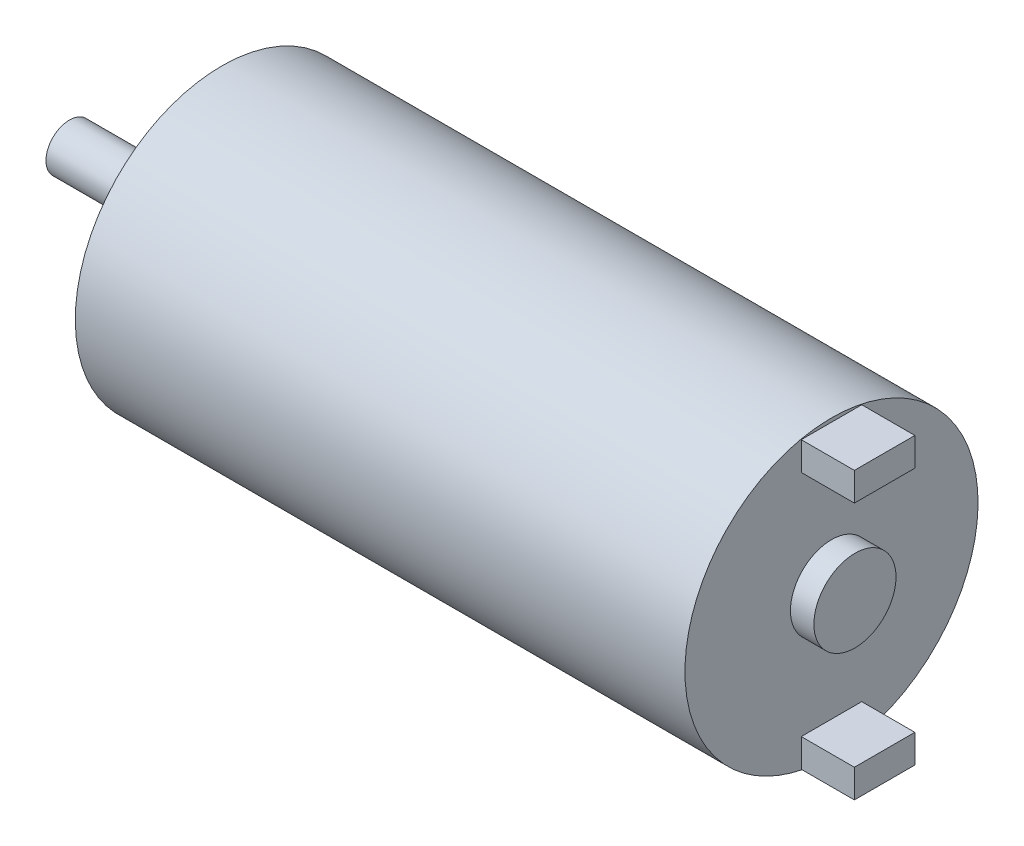
ISO-10303-21;
HEADER;
FILE_DESCRIPTION(('STEP AP214'),'2;1');
FILE_NAME('part.step','',(''),(''),'','','');
FILE_SCHEMA(('AUTOMOTIVE_DESIGN { 1 0 10303 214 1 1 1 1 }'));
ENDSEC;
DATA;
#1=APPLICATION_CONTEXT('core data for automotive mechanical design processes');
#2=APPLICATION_PROTOCOL_DEFINITION('international standard','automotive_design',2000,#1);
#3=PRODUCT_CONTEXT('',#1,'mechanical');
#4=PRODUCT('Part','Part','',(#3));
#5=PRODUCT_RELATED_PRODUCT_CATEGORY('part','',(#4));
#6=PRODUCT_DEFINITION_FORMATION('','',#4);
#7=PRODUCT_DEFINITION_CONTEXT('part definition',#1,'design');
#8=PRODUCT_DEFINITION('design','',#6,#7);
#9=PRODUCT_DEFINITION_SHAPE('','',#8);
#10=(LENGTH_UNIT() NAMED_UNIT(*) SI_UNIT(.MILLI.,.METRE.));
#11=(NAMED_UNIT(*) PLANE_ANGLE_UNIT() SI_UNIT($,.RADIAN.));
#12=(NAMED_UNIT(*) SI_UNIT($,.STERADIAN.) SOLID_ANGLE_UNIT());
#13=UNCERTAINTY_MEASURE_WITH_UNIT(LENGTH_MEASURE(1.E-05),#10,'distance_accuracy_value','');
#14=(GEOMETRIC_REPRESENTATION_CONTEXT(3) GLOBAL_UNCERTAINTY_ASSIGNED_CONTEXT((#13)) GLOBAL_UNIT_ASSIGNED_CONTEXT((#10,
#11,#12)) REPRESENTATION_CONTEXT('',''));
#15=CARTESIAN_POINT('',(0.,0.,0.));
#16=DIRECTION('',(0.,0.,1.));
#17=DIRECTION('',(1.,0.,0.));
#18=AXIS2_PLACEMENT_3D('',#15,#16,#17);
#19=CARTESIAN_POINT('',(93.7915045433173,98.65855174582,-2.37725431282084));
#20=DIRECTION('',(-1.,0.,0.));
#21=DIRECTION('',(0.,0.,1.));
#22=AXIS2_PLACEMENT_3D('',#19,#20,#21);
#23=PLANE('',#22);
#24=CARTESIAN_POINT('',(93.7915045433173,94.24655174582,0.0347456871791634));
#25=CARTESIAN_POINT('',(93.7915045433173,94.24655174582,-1.96525431282083));
#26=CARTESIAN_POINT('',(93.7915045433173,96.24655174582,-1.96525431282084));
#27=CARTESIAN_POINT('',(93.7915045433173,98.24655174582,-1.96525431282083));
#28=CARTESIAN_POINT('',(93.7915045433173,98.24655174582,0.0347456871791634));
#29=CARTESIAN_POINT('',(93.7915045433173,98.24655174582,2.03474568717916));
#30=CARTESIAN_POINT('',(93.7915045433173,96.24655174582,2.03474568717916));
#31=CARTESIAN_POINT('',(93.7915045433173,94.24655174582,2.03474568717916));
#32=CARTESIAN_POINT('',(93.7915045433173,94.24655174582,0.0347456871791634));
#33=(BOUNDED_CURVE() B_SPLINE_CURVE(2,(#24,#25,#26,#27,#28,#29,#30,#31,#32),.UNSPECIFIED.,.T.,
.F.) B_SPLINE_CURVE_WITH_KNOTS((3,2,2,2,3),(0.,4.,8.,12.,16.),
.UNSPECIFIED.) CURVE() GEOMETRIC_REPRESENTATION_ITEM() RATIONAL_B_SPLINE_CURVE((1.,
0.707106781186548,1.,0.707106781186548,1.,0.707106781186548,1.,0.707106781186548,1.)) REPRESENTATION_ITEM(''));
#34=CARTESIAN_POINT('',(93.7915045433173,94.24655174582,0.0347456871791634));
#35=VERTEX_POINT('',#34);
#36=EDGE_CURVE('E258',#35,#35,#33,.T.);
#37=ORIENTED_EDGE('',*,*,#36,.F.);
#38=EDGE_LOOP('',(#37));
#39=FACE_BOUND('',#38,.T.);
#40=ADVANCED_FACE('F19',(#39),#23,.T.);
#41=CARTESIAN_POINT('',(158.326499748419,86.490900444298,-3.07287537024688));
#42=DIRECTION('',(0.,1.,0.));
#43=DIRECTION('',(1.,0.,0.));
#44=AXIS2_PLACEMENT_3D('',#41,#42,#43);
#45=PLANE('',#44);
#46=CARTESIAN_POINT('',(163.3215524923,86.490900444298,2.61442990170087));
#47=CARTESIAN_POINT('',(158.791504543317,86.490900444298,2.61442990170087));
#48=(BOUNDED_CURVE() B_SPLINE_CURVE(1,(#46,#47),.UNSPECIFIED.,.F.,
.F.) B_SPLINE_CURVE_WITH_KNOTS((2,2),(0.,4.5300479489826),
.UNSPECIFIED.) CURVE() GEOMETRIC_REPRESENTATION_ITEM() RATIONAL_B_SPLINE_CURVE((1.,1.)) REPRESENTATION_ITEM(''));
#49=CARTESIAN_POINT('',(163.3215524923,86.4909004442981,2.61442990170087));
#50=VERTEX_POINT('',#49);
#51=CARTESIAN_POINT('',(158.791504543317,86.4909004442981,2.61442990170087));
#52=VERTEX_POINT('',#51);
#53=EDGE_CURVE('E12',#50,#52,#48,.T.);
#54=ORIENTED_EDGE('',*,*,#53,.F.);
#55=CARTESIAN_POINT('',(163.3215524923,86.490900444298,-2.54493852734254));
#56=CARTESIAN_POINT('',(163.3215524923,86.490900444298,2.61442990170087));
#57=(BOUNDED_CURVE() B_SPLINE_CURVE(1,(#55,#56),.UNSPECIFIED.,.F.,
.F.) B_SPLINE_CURVE_WITH_KNOTS((2,2),(0.,5.15936842904341),
.UNSPECIFIED.) CURVE() GEOMETRIC_REPRESENTATION_ITEM() RATIONAL_B_SPLINE_CURVE((1.,1.)) REPRESENTATION_ITEM(''));
#58=CARTESIAN_POINT('',(163.3215524923,86.4909004442981,-2.54493852734254));
#59=VERTEX_POINT('',#58);
#60=EDGE_CURVE('E268',#59,#50,#57,.T.);
#61=ORIENTED_EDGE('',*,*,#60,.F.);
#62=CARTESIAN_POINT('',(158.791504543317,86.490900444298,-2.54493852734254));
#63=CARTESIAN_POINT('',(163.3215524923,86.490900444298,-2.54493852734254));
#64=(BOUNDED_CURVE() B_SPLINE_CURVE(1,(#62,#63),.UNSPECIFIED.,.F.,
.F.) B_SPLINE_CURVE_WITH_KNOTS((2,2),(0.,4.5300479489826),
.UNSPECIFIED.) CURVE() GEOMETRIC_REPRESENTATION_ITEM() RATIONAL_B_SPLINE_CURVE((1.,1.)) REPRESENTATION_ITEM(''));
#65=CARTESIAN_POINT('',(158.791504543317,86.4909004442981,-2.54493852734254));
#66=VERTEX_POINT('',#65);
#67=EDGE_CURVE('E320',#66,#59,#64,.T.);
#68=ORIENTED_EDGE('',*,*,#67,.F.);
#69=CARTESIAN_POINT('',(158.791504543317,86.490900444298,2.61442990170087));
#70=CARTESIAN_POINT('',(158.791504543317,86.490900444298,-2.54493852734254));
#71=(BOUNDED_CURVE() B_SPLINE_CURVE(1,(#69,#70),.UNSPECIFIED.,.F.,
.F.) B_SPLINE_CURVE_WITH_KNOTS((2,2),(0.,5.15936842904341),
.UNSPECIFIED.) CURVE() GEOMETRIC_REPRESENTATION_ITEM() RATIONAL_B_SPLINE_CURVE((1.,1.)) REPRESENTATION_ITEM(''));
#72=EDGE_CURVE('E313',#52,#66,#71,.T.);
#73=ORIENTED_EDGE('',*,*,#72,.F.);
#74=EDGE_LOOP('',(#54,#61,#68,#73));
#75=FACE_BOUND('',#74,.T.);
#76=ADVANCED_FACE('F394',(#75),#45,.T.);
#77=CARTESIAN_POINT('',(158.326499748419,83.8190886421131,2.61442990170087));
#78=DIRECTION('',(0.,0.,1.));
#79=DIRECTION('',(1.,0.,0.));
#80=AXIS2_PLACEMENT_3D('',#77,#78,#79);
#81=PLANE('',#80);
#82=CARTESIAN_POINT('',(163.3215524923,84.072889715039,2.61442990170087));
#83=CARTESIAN_POINT('',(158.791504543317,84.072889715039,2.61442990170087));
#84=(BOUNDED_CURVE() B_SPLINE_CURVE(1,(#82,#83),.UNSPECIFIED.,.F.,
.F.) B_SPLINE_CURVE_WITH_KNOTS((2,2),(0.,4.5300479489826),
.UNSPECIFIED.) CURVE() GEOMETRIC_REPRESENTATION_ITEM() RATIONAL_B_SPLINE_CURVE((1.,1.)) REPRESENTATION_ITEM(''));
#85=CARTESIAN_POINT('',(163.3215524923,84.072889715039,2.61442990170087));
#86=VERTEX_POINT('',#85);
#87=CARTESIAN_POINT('',(158.791504543317,84.072889715039,2.61442990170087));
#88=VERTEX_POINT('',#87);
#89=EDGE_CURVE('E32',#86,#88,#84,.T.);
#90=ORIENTED_EDGE('',*,*,#89,.F.);
#91=CARTESIAN_POINT('',(163.3215524923,86.490900444298,2.61442990170087));
#92=CARTESIAN_POINT('',(163.3215524923,84.072889715039,2.61442990170087));
#93=(BOUNDED_CURVE() B_SPLINE_CURVE(1,(#91,#92),.UNSPECIFIED.,.F.,
.F.) B_SPLINE_CURVE_WITH_KNOTS((2,2),(0.,2.41801072925898),
.UNSPECIFIED.) CURVE() GEOMETRIC_REPRESENTATION_ITEM() RATIONAL_B_SPLINE_CURVE((1.,1.)) REPRESENTATION_ITEM(''));
#94=EDGE_CURVE('E346',#50,#86,#93,.T.);
#95=ORIENTED_EDGE('',*,*,#94,.F.);
#96=ORIENTED_EDGE('',*,*,#53,.T.);
#97=CARTESIAN_POINT('',(158.791504543317,84.072889715039,2.61442990170087));
#98=CARTESIAN_POINT('',(158.791504543317,86.490900444298,2.61442990170087));
#99=(BOUNDED_CURVE() B_SPLINE_CURVE(1,(#97,#98),.UNSPECIFIED.,.F.,
.F.) B_SPLINE_CURVE_WITH_KNOTS((2,2),(0.,2.41801072925898),
.UNSPECIFIED.) CURVE() GEOMETRIC_REPRESENTATION_ITEM() RATIONAL_B_SPLINE_CURVE((1.,1.)) REPRESENTATION_ITEM(''));
#100=EDGE_CURVE('E227',#88,#52,#99,.T.);
#101=ORIENTED_EDGE('',*,*,#100,.F.);
#102=EDGE_LOOP('',(#90,#95,#96,#101));
#103=FACE_BOUND('',#102,.T.);
#104=ADVANCED_FACE('F386',(#103),#81,.T.);
#105=CARTESIAN_POINT('',(158.326499748419,84.072889715039,3.14236674460521));
#106=DIRECTION('',(0.,-1.,0.));
#107=DIRECTION('',(0.,0.,-1.));
#108=AXIS2_PLACEMENT_3D('',#105,#106,#107);
#109=PLANE('',#108);
#110=CARTESIAN_POINT('',(163.3215524923,84.072889715039,-2.54493852734254));
#111=CARTESIAN_POINT('',(158.791504543317,84.072889715039,-2.54493852734254));
#112=(BOUNDED_CURVE() B_SPLINE_CURVE(1,(#110,#111),.UNSPECIFIED.,.F.,
.F.) B_SPLINE_CURVE_WITH_KNOTS((2,2),(0.,4.5300479489826),
.UNSPECIFIED.) CURVE() GEOMETRIC_REPRESENTATION_ITEM() RATIONAL_B_SPLINE_CURVE((1.,1.)) REPRESENTATION_ITEM(''));
#113=CARTESIAN_POINT('',(163.3215524923,84.072889715039,-2.54493852734254));
#114=VERTEX_POINT('',#113);
#115=CARTESIAN_POINT('',(158.791504543317,84.072889715039,-2.54493852734254));
#116=VERTEX_POINT('',#115);
#117=EDGE_CURVE('E287',#114,#116,#112,.T.);
#118=ORIENTED_EDGE('',*,*,#117,.F.);
#119=CARTESIAN_POINT('',(163.3215524923,84.072889715039,2.61442990170087));
#120=CARTESIAN_POINT('',(163.3215524923,84.072889715039,-2.54493852734254));
#121=(BOUNDED_CURVE() B_SPLINE_CURVE(1,(#119,#120),.UNSPECIFIED.,.F.,
.F.) B_SPLINE_CURVE_WITH_KNOTS((2,2),(0.,5.15936842904341),
.UNSPECIFIED.) CURVE() GEOMETRIC_REPRESENTATION_ITEM() RATIONAL_B_SPLINE_CURVE((1.,1.)) REPRESENTATION_ITEM(''));
#122=EDGE_CURVE('E183',#86,#114,#121,.T.);
#123=ORIENTED_EDGE('',*,*,#122,.F.);
#124=ORIENTED_EDGE('',*,*,#89,.T.);
#125=CARTESIAN_POINT('',(158.791504543317,84.072889715039,-2.54493852734254));
#126=CARTESIAN_POINT('',(158.791504543317,84.072889715039,2.61442990170087));
#127=(BOUNDED_CURVE() B_SPLINE_CURVE(1,(#125,#126),.UNSPECIFIED.,.F.,
.F.) B_SPLINE_CURVE_WITH_KNOTS((2,2),(0.,5.15936842904341),
.UNSPECIFIED.) CURVE() GEOMETRIC_REPRESENTATION_ITEM() RATIONAL_B_SPLINE_CURVE((1.,1.)) REPRESENTATION_ITEM(''));
#128=EDGE_CURVE('E219',#116,#88,#127,.T.);
#129=ORIENTED_EDGE('',*,*,#128,.F.);
#130=EDGE_LOOP('',(#118,#123,#124,#129));
#131=FACE_BOUND('',#130,.T.);
#132=ADVANCED_FACE('F384',(#131),#109,.T.);
#133=CARTESIAN_POINT('',(163.786557287198,83.8190886421131,-2.54493852734254));
#134=DIRECTION('',(0.,0.,-1.));
#135=DIRECTION('',(0.,-1.,0.));
#136=AXIS2_PLACEMENT_3D('',#133,#134,#135);
#137=PLANE('',#136);
#138=ORIENTED_EDGE('',*,*,#67,.T.);
#139=CARTESIAN_POINT('',(163.3215524923,84.072889715039,-2.54493852734254));
#140=CARTESIAN_POINT('',(163.3215524923,86.490900444298,-2.54493852734254));
#141=(BOUNDED_CURVE() B_SPLINE_CURVE(1,(#139,#140),.UNSPECIFIED.,.F.,
.F.) B_SPLINE_CURVE_WITH_KNOTS((2,2),(0.,2.41801072925898),
.UNSPECIFIED.) CURVE() GEOMETRIC_REPRESENTATION_ITEM() RATIONAL_B_SPLINE_CURVE((1.,1.)) REPRESENTATION_ITEM(''));
#142=EDGE_CURVE('E174',#114,#59,#141,.T.);
#143=ORIENTED_EDGE('',*,*,#142,.F.);
#144=ORIENTED_EDGE('',*,*,#117,.T.);
#145=CARTESIAN_POINT('',(158.791504543317,86.490900444298,-2.54493852734254));
#146=CARTESIAN_POINT('',(158.791504543317,84.072889715039,-2.54493852734254));
#147=(BOUNDED_CURVE() B_SPLINE_CURVE(1,(#145,#146),.UNSPECIFIED.,.F.,
.F.) B_SPLINE_CURVE_WITH_KNOTS((2,2),(0.,2.41801072925898),
.UNSPECIFIED.) CURVE() GEOMETRIC_REPRESENTATION_ITEM() RATIONAL_B_SPLINE_CURVE((1.,1.)) REPRESENTATION_ITEM(''));
#148=EDGE_CURVE('E228',#66,#116,#147,.T.);
#149=ORIENTED_EDGE('',*,*,#148,.F.);
#150=EDGE_LOOP('',(#138,#143,#144,#149));
#151=FACE_BOUND('',#150,.T.);
#152=ADVANCED_FACE('F382',(#151),#137,.T.);
#153=CARTESIAN_POINT('',(163.786557287198,105.748401974415,-2.54493852734254));
#154=DIRECTION('',(0.,0.,-1.));
#155=DIRECTION('',(0.,-1.,0.));
#156=AXIS2_PLACEMENT_3D('',#153,#154,#155);
#157=PLANE('',#156);
#158=CARTESIAN_POINT('',(163.3215524923,108.4202137766,-2.54493852734254));
#159=CARTESIAN_POINT('',(158.791504543317,108.4202137766,-2.54493852734254));
#160=(BOUNDED_CURVE() B_SPLINE_CURVE(1,(#158,#159),.UNSPECIFIED.,.F.,
.F.) B_SPLINE_CURVE_WITH_KNOTS((2,2),(0.,4.5300479489826),
.UNSPECIFIED.) CURVE() GEOMETRIC_REPRESENTATION_ITEM() RATIONAL_B_SPLINE_CURVE((1.,1.)) REPRESENTATION_ITEM(''));
#161=CARTESIAN_POINT('',(163.3215524923,108.4202137766,-2.54493852734254));
#162=VERTEX_POINT('',#161);
#163=CARTESIAN_POINT('',(158.791504543317,108.4202137766,-2.54493852734254));
#164=VERTEX_POINT('',#163);
#165=EDGE_CURVE('E329',#162,#164,#160,.T.);
#166=ORIENTED_EDGE('',*,*,#165,.F.);
#167=CARTESIAN_POINT('',(163.3215524923,106.002203047341,-2.54493852734254));
#168=CARTESIAN_POINT('',(163.3215524923,108.4202137766,-2.54493852734254));
#169=(BOUNDED_CURVE() B_SPLINE_CURVE(1,(#167,#168),.UNSPECIFIED.,.F.,
.F.) B_SPLINE_CURVE_WITH_KNOTS((2,2),(0.,2.41801072925898),
.UNSPECIFIED.) CURVE() GEOMETRIC_REPRESENTATION_ITEM() RATIONAL_B_SPLINE_CURVE((1.,1.)) REPRESENTATION_ITEM(''));
#170=CARTESIAN_POINT('',(163.3215524923,106.002203047341,-2.54493852734254));
#171=VERTEX_POINT('',#170);
#172=EDGE_CURVE('E182',#171,#162,#169,.T.);
#173=ORIENTED_EDGE('',*,*,#172,.F.);
#174=CARTESIAN_POINT('',(158.791504543317,106.002203047341,-2.54493852734254));
#175=CARTESIAN_POINT('',(163.3215524923,106.002203047341,-2.54493852734254));
#176=(BOUNDED_CURVE() B_SPLINE_CURVE(1,(#174,#175),.UNSPECIFIED.,.F.,
.F.) B_SPLINE_CURVE_WITH_KNOTS((2,2),(0.,4.5300479489826),
.UNSPECIFIED.) CURVE() GEOMETRIC_REPRESENTATION_ITEM() RATIONAL_B_SPLINE_CURVE((1.,1.)) REPRESENTATION_ITEM(''));
#177=CARTESIAN_POINT('',(158.791504543317,106.002203047341,-2.54493852734254));
#178=VERTEX_POINT('',#177);
#179=EDGE_CURVE('E146',#178,#171,#176,.T.);
#180=ORIENTED_EDGE('',*,*,#179,.F.);
#181=CARTESIAN_POINT('',(158.791504543317,108.4202137766,-2.54493852734254));
#182=CARTESIAN_POINT('',(158.791504543317,106.002203047341,-2.54493852734254));
#183=(BOUNDED_CURVE() B_SPLINE_CURVE(1,(#181,#182),.UNSPECIFIED.,.F.,
.F.) B_SPLINE_CURVE_WITH_KNOTS((2,2),(0.,2.41801072925898),
.UNSPECIFIED.) CURVE() GEOMETRIC_REPRESENTATION_ITEM() RATIONAL_B_SPLINE_CURVE((1.,1.)) REPRESENTATION_ITEM(''));
#184=EDGE_CURVE('E157',#164,#178,#183,.T.);
#185=ORIENTED_EDGE('',*,*,#184,.F.);
#186=EDGE_LOOP('',(#166,#173,#180,#185));
#187=FACE_BOUND('',#186,.T.);
#188=ADVANCED_FACE('F393',(#187),#157,.T.);
#189=CARTESIAN_POINT('',(158.326499748419,108.4202137766,-3.07287537024688));
#190=DIRECTION('',(0.,1.,0.));
#191=DIRECTION('',(1.,0.,0.));
#192=AXIS2_PLACEMENT_3D('',#189,#190,#191);
#193=PLANE('',#192);
#194=CARTESIAN_POINT('',(163.3215524923,108.4202137766,2.61442990170087));
#195=CARTESIAN_POINT('',(158.791504543317,108.4202137766,2.61442990170087));
#196=(BOUNDED_CURVE() B_SPLINE_CURVE(1,(#194,#195),.UNSPECIFIED.,.F.,
.F.) B_SPLINE_CURVE_WITH_KNOTS((2,2),(0.,4.5300479489826),
.UNSPECIFIED.) CURVE() GEOMETRIC_REPRESENTATION_ITEM() RATIONAL_B_SPLINE_CURVE((1.,1.)) REPRESENTATION_ITEM(''));
#197=CARTESIAN_POINT('',(163.3215524923,108.4202137766,2.61442990170087));
#198=VERTEX_POINT('',#197);
#199=CARTESIAN_POINT('',(158.791504543317,108.4202137766,2.61442990170087));
#200=VERTEX_POINT('',#199);
#201=EDGE_CURVE('E145',#198,#200,#196,.T.);
#202=ORIENTED_EDGE('',*,*,#201,.F.);
#203=CARTESIAN_POINT('',(163.3215524923,108.4202137766,-2.54493852734254));
#204=CARTESIAN_POINT('',(163.3215524923,108.4202137766,2.61442990170087));
#205=(BOUNDED_CURVE() B_SPLINE_CURVE(1,(#203,#204),.UNSPECIFIED.,.F.,
.F.) B_SPLINE_CURVE_WITH_KNOTS((2,2),(0.,5.15936842904341),
.UNSPECIFIED.) CURVE() GEOMETRIC_REPRESENTATION_ITEM() RATIONAL_B_SPLINE_CURVE((1.,1.)) REPRESENTATION_ITEM(''));
#206=EDGE_CURVE('E214',#162,#198,#205,.T.);
#207=ORIENTED_EDGE('',*,*,#206,.F.);
#208=ORIENTED_EDGE('',*,*,#165,.T.);
#209=CARTESIAN_POINT('',(158.791504543317,108.4202137766,2.61442990170087));
#210=CARTESIAN_POINT('',(158.791504543317,108.4202137766,-2.54493852734254));
#211=(BOUNDED_CURVE() B_SPLINE_CURVE(1,(#209,#210),.UNSPECIFIED.,.F.,
.F.) B_SPLINE_CURVE_WITH_KNOTS((2,2),(0.,5.15936842904341),
.UNSPECIFIED.) CURVE() GEOMETRIC_REPRESENTATION_ITEM() RATIONAL_B_SPLINE_CURVE((1.,1.)) REPRESENTATION_ITEM(''));
#212=EDGE_CURVE('E154',#200,#164,#211,.T.);
#213=ORIENTED_EDGE('',*,*,#212,.F.);
#214=EDGE_LOOP('',(#202,#207,#208,#213));
#215=FACE_BOUND('',#214,.T.);
#216=ADVANCED_FACE('F417',(#215),#193,.T.);
#217=CARTESIAN_POINT('',(158.326499748419,105.748401974415,2.61442990170087));
#218=DIRECTION('',(0.,0.,1.));
#219=DIRECTION('',(1.,0.,0.));
#220=AXIS2_PLACEMENT_3D('',#217,#218,#219);
#221=PLANE('',#220);
#222=CARTESIAN_POINT('',(163.3215524923,106.002203047341,2.61442990170087));
#223=CARTESIAN_POINT('',(158.791504543317,106.002203047341,2.61442990170087));
#224=(BOUNDED_CURVE() B_SPLINE_CURVE(1,(#222,#223),.UNSPECIFIED.,.F.,
.F.) B_SPLINE_CURVE_WITH_KNOTS((2,2),(0.,4.5300479489826),
.UNSPECIFIED.) CURVE() GEOMETRIC_REPRESENTATION_ITEM() RATIONAL_B_SPLINE_CURVE((1.,1.)) REPRESENTATION_ITEM(''));
#225=CARTESIAN_POINT('',(163.3215524923,106.002203047341,2.61442990170087));
#226=VERTEX_POINT('',#225);
#227=CARTESIAN_POINT('',(158.791504543317,106.002203047341,2.61442990170087));
#228=VERTEX_POINT('',#227);
#229=EDGE_CURVE('E133',#226,#228,#224,.T.);
#230=ORIENTED_EDGE('',*,*,#229,.F.);
#231=CARTESIAN_POINT('',(163.3215524923,108.4202137766,2.61442990170087));
#232=CARTESIAN_POINT('',(163.3215524923,106.002203047341,2.61442990170087));
#233=(BOUNDED_CURVE() B_SPLINE_CURVE(1,(#231,#232),.UNSPECIFIED.,.F.,
.F.) B_SPLINE_CURVE_WITH_KNOTS((2,2),(0.,2.41801072925898),
.UNSPECIFIED.) CURVE() GEOMETRIC_REPRESENTATION_ITEM() RATIONAL_B_SPLINE_CURVE((1.,1.)) REPRESENTATION_ITEM(''));
#234=EDGE_CURVE('E473',#198,#226,#233,.T.);
#235=ORIENTED_EDGE('',*,*,#234,.F.);
#236=ORIENTED_EDGE('',*,*,#201,.T.);
#237=CARTESIAN_POINT('',(158.791504543317,106.002203047341,2.61442990170087));
#238=CARTESIAN_POINT('',(158.791504543317,108.4202137766,2.61442990170087));
#239=(BOUNDED_CURVE() B_SPLINE_CURVE(1,(#237,#238),.UNSPECIFIED.,.F.,
.F.) B_SPLINE_CURVE_WITH_KNOTS((2,2),(0.,2.41801072925898),
.UNSPECIFIED.) CURVE() GEOMETRIC_REPRESENTATION_ITEM() RATIONAL_B_SPLINE_CURVE((1.,1.)) REPRESENTATION_ITEM(''));
#240=EDGE_CURVE('E23',#228,#200,#239,.T.);
#241=ORIENTED_EDGE('',*,*,#240,.F.);
#242=EDGE_LOOP('',(#230,#235,#236,#241));
#243=FACE_BOUND('',#242,.T.);
#244=ADVANCED_FACE('F149',(#243),#221,.T.);
#245=CARTESIAN_POINT('',(158.326499748419,106.002203047341,3.14236674460521));
#246=DIRECTION('',(0.,-1.,0.));
#247=DIRECTION('',(0.,0.,-1.));
#248=AXIS2_PLACEMENT_3D('',#245,#246,#247);
#249=PLANE('',#248);
#250=ORIENTED_EDGE('',*,*,#179,.T.);
#251=CARTESIAN_POINT('',(163.3215524923,106.002203047341,2.61442990170087));
#252=CARTESIAN_POINT('',(163.3215524923,106.002203047341,-2.54493852734254));
#253=(BOUNDED_CURVE() B_SPLINE_CURVE(1,(#251,#252),.UNSPECIFIED.,.F.,
.F.) B_SPLINE_CURVE_WITH_KNOTS((2,2),(0.,5.15936842904341),
.UNSPECIFIED.) CURVE() GEOMETRIC_REPRESENTATION_ITEM() RATIONAL_B_SPLINE_CURVE((1.,1.)) REPRESENTATION_ITEM(''));
#254=EDGE_CURVE('E140',#226,#171,#253,.T.);
#255=ORIENTED_EDGE('',*,*,#254,.F.);
#256=ORIENTED_EDGE('',*,*,#229,.T.);
#257=CARTESIAN_POINT('',(158.791504543317,106.002203047341,-2.54493852734254));
#258=CARTESIAN_POINT('',(158.791504543317,106.002203047341,2.61442990170087));
#259=(BOUNDED_CURVE() B_SPLINE_CURVE(1,(#257,#258),.UNSPECIFIED.,.F.,
.F.) B_SPLINE_CURVE_WITH_KNOTS((2,2),(0.,5.15936842904341),
.UNSPECIFIED.) CURVE() GEOMETRIC_REPRESENTATION_ITEM() RATIONAL_B_SPLINE_CURVE((1.,1.)) REPRESENTATION_ITEM(''));
#260=EDGE_CURVE('E137',#178,#228,#259,.T.);
#261=ORIENTED_EDGE('',*,*,#260,.F.);
#262=EDGE_LOOP('',(#250,#255,#256,#261));
#263=FACE_BOUND('',#262,.T.);
#264=ADVANCED_FACE('F135',(#263),#249,.T.);
#265=CARTESIAN_POINT('',(159.791504543317,96.24655174582,0.0347456871791678));
#266=DIRECTION('',(-1.,0.,0.));
#267=DIRECTION('',(0.,-1.,0.));
#268=AXIS2_PLACEMENT_3D('',#265,#266,#267);
#269=CYLINDRICAL_SURFACE('',#268,3.5);
#270=CARTESIAN_POINT('',(158.791504543317,92.74655174582,0.0347456871791634));
#271=CARTESIAN_POINT('',(158.791504543317,92.74655174582,3.53474568717916));
#272=CARTESIAN_POINT('',(158.791504543317,96.24655174582,3.53474568717916));
#273=CARTESIAN_POINT('',(158.791504543317,99.74655174582,3.53474568717916));
#274=CARTESIAN_POINT('',(158.791504543317,99.74655174582,0.0347456871791634));
#275=CARTESIAN_POINT('',(158.791504543317,99.74655174582,-3.46525431282083));
#276=CARTESIAN_POINT('',(158.791504543317,96.24655174582,-3.46525431282084));
#277=CARTESIAN_POINT('',(158.791504543317,92.74655174582,-3.46525431282083));
#278=CARTESIAN_POINT('',(158.791504543317,92.74655174582,0.0347456871791634));
#279=(BOUNDED_CURVE() B_SPLINE_CURVE(2,(#270,#271,#272,#273,#274,#275,#276,#277,#278),
.UNSPECIFIED.,.T.,.F.) B_SPLINE_CURVE_WITH_KNOTS((3,2,2,2,3),(-28.,-21.,-14.,-7.,0.),
.UNSPECIFIED.) CURVE() GEOMETRIC_REPRESENTATION_ITEM() RATIONAL_B_SPLINE_CURVE((1.,
0.707106781186548,1.,0.707106781186548,1.,0.707106781186548,1.,0.707106781186548,1.)) REPRESENTATION_ITEM(''));
#280=CARTESIAN_POINT('',(158.791504543317,92.74655174582,0.0347456871791634));
#281=VERTEX_POINT('',#280);
#282=EDGE_CURVE('E164',#281,#281,#279,.T.);
#283=ORIENTED_EDGE('',*,*,#282,.F.);
#284=CARTESIAN_POINT('',(160.791504543317,92.74655174582,0.0347456871791634));
#285=CARTESIAN_POINT('',(158.791504543317,92.74655174582,0.0347456871791634));
#286=(BOUNDED_CURVE() B_SPLINE_CURVE(1,(#284,#285),.UNSPECIFIED.,.F.,
.F.) B_SPLINE_CURVE_WITH_KNOTS((2,2),(0.212000000000013,2.212),
.UNSPECIFIED.) CURVE() GEOMETRIC_REPRESENTATION_ITEM() RATIONAL_B_SPLINE_CURVE((1.,1.)) REPRESENTATION_ITEM(''));
#287=CARTESIAN_POINT('',(160.791504543317,92.74655174582,0.0347456871791634));
#288=VERTEX_POINT('',#287);
#289=EDGE_CURVE('E170',#288,#281,#286,.T.);
#290=ORIENTED_EDGE('',*,*,#289,.F.);
#291=CARTESIAN_POINT('',(160.791504543317,92.74655174582,0.0347456871791634));
#292=CARTESIAN_POINT('',(160.791504543317,92.74655174582,-3.46525431282083));
#293=CARTESIAN_POINT('',(160.791504543317,96.24655174582,-3.46525431282084));
#294=CARTESIAN_POINT('',(160.791504543317,99.74655174582,-3.46525431282083));
#295=CARTESIAN_POINT('',(160.791504543317,99.74655174582,0.0347456871791634));
#296=CARTESIAN_POINT('',(160.791504543317,99.74655174582,3.53474568717916));
#297=CARTESIAN_POINT('',(160.791504543317,96.24655174582,3.53474568717916));
#298=CARTESIAN_POINT('',(160.791504543317,92.74655174582,3.53474568717916));
#299=CARTESIAN_POINT('',(160.791504543317,92.74655174582,0.0347456871791634));
#300=(BOUNDED_CURVE() B_SPLINE_CURVE(2,(#291,#292,#293,#294,#295,#296,#297,#298,#299),
.UNSPECIFIED.,.T.,.F.) B_SPLINE_CURVE_WITH_KNOTS((3,2,2,2,3),(-28.,-21.,-14.,-7.,0.),
.UNSPECIFIED.) CURVE() GEOMETRIC_REPRESENTATION_ITEM() RATIONAL_B_SPLINE_CURVE((1.,
0.707106781186548,1.,0.707106781186548,1.,0.707106781186548,1.,0.707106781186548,1.)) REPRESENTATION_ITEM(''));
#301=EDGE_CURVE('E301',#288,#288,#300,.T.);
#302=ORIENTED_EDGE('',*,*,#301,.F.);
#303=ORIENTED_EDGE('',*,*,#289,.T.);
#304=EDGE_LOOP('',(#283,#290,#302,#303));
#305=FACE_BOUND('',#304,.T.);
#306=ADVANCED_FACE('F420',(#305),#269,.T.);
#307=CARTESIAN_POINT('',(106.791504543317,111.25855174582,-14.9772543128208));
#308=DIRECTION('',(-1.,0.,0.));
#309=DIRECTION('',(0.,0.,1.));
#310=AXIS2_PLACEMENT_3D('',#307,#308,#309);
#311=PLANE('',#310);
#312=CARTESIAN_POINT('',(106.791504543317,92.74655174582,0.0347456871791634));
#313=CARTESIAN_POINT('',(106.791504543317,92.74655174582,3.53474568717916));
#314=CARTESIAN_POINT('',(106.791504543317,96.24655174582,3.53474568717916));
#315=CARTESIAN_POINT('',(106.791504543317,99.74655174582,3.53474568717916));
#316=CARTESIAN_POINT('',(106.791504543317,99.74655174582,0.0347456871791634));
#317=CARTESIAN_POINT('',(106.791504543317,99.74655174582,-3.46525431282083));
#318=CARTESIAN_POINT('',(106.791504543317,96.24655174582,-3.46525431282084));
#319=CARTESIAN_POINT('',(106.791504543317,92.74655174582,-3.46525431282083));
#320=CARTESIAN_POINT('',(106.791504543317,92.74655174582,0.0347456871791634));
#321=(BOUNDED_CURVE() B_SPLINE_CURVE(2,(#312,#313,#314,#315,#316,#317,#318,#319,#320),
.UNSPECIFIED.,.T.,.F.) B_SPLINE_CURVE_WITH_KNOTS((3,2,2,2,3),(0.,7.,14.,21.,28.),
.UNSPECIFIED.) CURVE() GEOMETRIC_REPRESENTATION_ITEM() RATIONAL_B_SPLINE_CURVE((1.,
0.707106781186548,1.,0.707106781186548,1.,0.707106781186548,1.,0.707106781186548,1.)) REPRESENTATION_ITEM(''));
#322=CARTESIAN_POINT('',(106.791504543317,92.74655174582,0.0347456871791634));
#323=VERTEX_POINT('',#322);
#324=EDGE_CURVE('E292',#323,#323,#321,.T.);
#325=ORIENTED_EDGE('',*,*,#324,.F.);
#326=EDGE_LOOP('',(#325));
#327=FACE_BOUND('',#326,.T.);
#328=CARTESIAN_POINT('',(106.791504543317,83.74655174582,0.0347456871791634));
#329=CARTESIAN_POINT('',(106.791504543317,83.74655174582,-12.4652543128208));
#330=CARTESIAN_POINT('',(106.791504543317,96.24655174582,-12.4652543128208));
#331=CARTESIAN_POINT('',(106.791504543317,108.74655174582,-12.4652543128208));
#332=CARTESIAN_POINT('',(106.791504543317,108.74655174582,0.0347456871791634));
#333=CARTESIAN_POINT('',(106.791504543317,108.74655174582,12.5347456871792));
#334=CARTESIAN_POINT('',(106.791504543317,96.24655174582,12.5347456871792));
#335=CARTESIAN_POINT('',(106.791504543317,83.74655174582,12.5347456871792));
#336=CARTESIAN_POINT('',(106.791504543317,83.74655174582,0.0347456871791634));
#337=(BOUNDED_CURVE() B_SPLINE_CURVE(2,(#328,#329,#330,#331,#332,#333,#334,#335,#336),
.UNSPECIFIED.,.T.,.F.) B_SPLINE_CURVE_WITH_KNOTS((3,2,2,2,3),(0.,25.,50.,75.,100.),
.UNSPECIFIED.) CURVE() GEOMETRIC_REPRESENTATION_ITEM() RATIONAL_B_SPLINE_CURVE((1.,
0.707106781186548,1.,0.707106781186548,1.,0.707106781186548,1.,0.707106781186548,1.)) REPRESENTATION_ITEM(''));
#338=CARTESIAN_POINT('',(106.791504543317,83.74655174582,0.0347456871791634));
#339=VERTEX_POINT('',#338);
#340=EDGE_CURVE('E448',#339,#339,#337,.T.);
#341=ORIENTED_EDGE('',*,*,#340,.F.);
#342=EDGE_LOOP('',(#341));
#343=FACE_BOUND('',#342,.T.);
#344=ADVANCED_FACE('F423',(#327,#343),#311,.T.);
#345=CARTESIAN_POINT('',(158.791504543317,81.23455174582,-14.9772543128208));
#346=DIRECTION('',(1.,0.,0.));
#347=DIRECTION('',(0.,1.,0.));
#348=AXIS2_PLACEMENT_3D('',#345,#346,#347);
#349=PLANE('',#348);
#350=ORIENTED_EDGE('',*,*,#72,.T.);
#351=ORIENTED_EDGE('',*,*,#148,.T.);
#352=ORIENTED_EDGE('',*,*,#128,.T.);
#353=ORIENTED_EDGE('',*,*,#100,.T.);
#354=EDGE_LOOP('',(#350,#351,#352,#353));
#355=FACE_BOUND('',#354,.T.);
#356=ORIENTED_EDGE('',*,*,#184,.T.);
#357=ORIENTED_EDGE('',*,*,#260,.T.);
#358=ORIENTED_EDGE('',*,*,#240,.T.);
#359=ORIENTED_EDGE('',*,*,#212,.T.);
#360=EDGE_LOOP('',(#356,#357,#358,#359));
#361=FACE_BOUND('',#360,.T.);
#362=ORIENTED_EDGE('',*,*,#282,.T.);
#363=EDGE_LOOP('',(#362));
#364=FACE_BOUND('',#363,.T.);
#365=CARTESIAN_POINT('',(158.791504543317,83.74655174582,0.0347456871791634));
#366=CARTESIAN_POINT('',(158.791504543317,83.74655174582,12.5347456871792));
#367=CARTESIAN_POINT('',(158.791504543317,96.24655174582,12.5347456871792));
#368=CARTESIAN_POINT('',(158.791504543317,108.74655174582,12.5347456871792));
#369=CARTESIAN_POINT('',(158.791504543317,108.74655174582,0.0347456871791634));
#370=CARTESIAN_POINT('',(158.791504543317,108.74655174582,-12.4652543128208));
#371=CARTESIAN_POINT('',(158.791504543317,96.24655174582,-12.4652543128208));
#372=CARTESIAN_POINT('',(158.791504543317,83.74655174582,-12.4652543128208));
#373=CARTESIAN_POINT('',(158.791504543317,83.74655174582,0.0347456871791634));
#374=(BOUNDED_CURVE() B_SPLINE_CURVE(2,(#365,#366,#367,#368,#369,#370,#371,#372,#373),
.UNSPECIFIED.,.T.,.F.) B_SPLINE_CURVE_WITH_KNOTS((3,2,2,2,3),(0.,25.,50.,75.,100.),
.UNSPECIFIED.) CURVE() GEOMETRIC_REPRESENTATION_ITEM() RATIONAL_B_SPLINE_CURVE((1.,
0.707106781186548,1.,0.707106781186548,1.,0.707106781186548,1.,0.707106781186548,1.)) REPRESENTATION_ITEM(''));
#375=CARTESIAN_POINT('',(158.791504543317,83.74655174582,0.0347456871791634));
#376=VERTEX_POINT('',#375);
#377=EDGE_CURVE('E236',#376,#376,#374,.T.);
#378=ORIENTED_EDGE('',*,*,#377,.F.);
#379=EDGE_LOOP('',(#378));
#380=FACE_BOUND('',#379,.T.);
#381=ADVANCED_FACE('F21',(#355,#361,#364,#380),#349,.T.);
#382=CARTESIAN_POINT('',(132.791504543317,96.24655174582,0.0347456871791277));
#383=DIRECTION('',(-1.,0.,0.));
#384=DIRECTION('',(0.,-1.,0.));
#385=AXIS2_PLACEMENT_3D('',#382,#383,#384);
#386=CYLINDRICAL_SURFACE('',#385,12.5);
#387=ORIENTED_EDGE('',*,*,#340,.T.);
#388=CARTESIAN_POINT('',(158.791504543317,83.74655174582,0.0347456871791634));
#389=CARTESIAN_POINT('',(106.791504543317,83.74655174582,0.0347456871791634));
#390=(BOUNDED_CURVE() B_SPLINE_CURVE(1,(#388,#389),.UNSPECIFIED.,.F.,
.F.) B_SPLINE_CURVE_WITH_KNOTS((2,2),(5.212,57.212),
.UNSPECIFIED.) CURVE() GEOMETRIC_REPRESENTATION_ITEM() RATIONAL_B_SPLINE_CURVE((1.,1.)) REPRESENTATION_ITEM(''));
#391=EDGE_CURVE('E215',#376,#339,#390,.T.);
#392=ORIENTED_EDGE('',*,*,#391,.F.);
#393=ORIENTED_EDGE('',*,*,#377,.T.);
#394=ORIENTED_EDGE('',*,*,#391,.T.);
#395=EDGE_LOOP('',(#387,#392,#393,#394));
#396=FACE_BOUND('',#395,.T.);
#397=ADVANCED_FACE('F414',(#396),#386,.T.);
#398=CARTESIAN_POINT('',(160.791504543317,92.03455174582,-4.17725431282084));
#399=DIRECTION('',(1.,0.,0.));
#400=DIRECTION('',(0.,1.,0.));
#401=AXIS2_PLACEMENT_3D('',#398,#399,#400);
#402=PLANE('',#401);
#403=ORIENTED_EDGE('',*,*,#301,.T.);
#404=EDGE_LOOP('',(#403));
#405=FACE_BOUND('',#404,.T.);
#406=ADVANCED_FACE('F410',(#405),#402,.T.);
#407=CARTESIAN_POINT('',(103.791504543317,100.45855174582,-4.17725431282084));
#408=DIRECTION('',(-1.,0.,0.));
#409=DIRECTION('',(0.,0.,1.));
#410=AXIS2_PLACEMENT_3D('',#407,#408,#409);
#411=PLANE('',#410);
#412=CARTESIAN_POINT('',(103.791504543317,94.24655174582,0.0347456871791634));
#413=CARTESIAN_POINT('',(103.791504543317,94.24655174582,2.03474568717916));
#414=CARTESIAN_POINT('',(103.791504543317,96.24655174582,2.03474568717916));
#415=CARTESIAN_POINT('',(103.791504543317,98.24655174582,2.03474568717916));
#416=CARTESIAN_POINT('',(103.791504543317,98.24655174582,0.0347456871791634));
#417=CARTESIAN_POINT('',(103.791504543317,98.24655174582,-1.96525431282083));
#418=CARTESIAN_POINT('',(103.791504543317,96.24655174582,-1.96525431282084));
#419=CARTESIAN_POINT('',(103.791504543317,94.24655174582,-1.96525431282083));
#420=CARTESIAN_POINT('',(103.791504543317,94.24655174582,0.0347456871791634));
#421=(BOUNDED_CURVE() B_SPLINE_CURVE(2,(#412,#413,#414,#415,#416,#417,#418,#419,#420),
.UNSPECIFIED.,.T.,.F.) B_SPLINE_CURVE_WITH_KNOTS((3,2,2,2,3),(0.,4.,8.,12.,16.),
.UNSPECIFIED.) CURVE() GEOMETRIC_REPRESENTATION_ITEM() RATIONAL_B_SPLINE_CURVE((1.,
0.707106781186548,1.,0.707106781186548,1.,0.707106781186548,1.,0.707106781186548,1.)) REPRESENTATION_ITEM(''));
#422=CARTESIAN_POINT('',(103.791504543317,94.24655174582,0.0347456871791634));
#423=VERTEX_POINT('',#422);
#424=EDGE_CURVE('E184',#423,#423,#421,.T.);
#425=ORIENTED_EDGE('',*,*,#424,.F.);
#426=EDGE_LOOP('',(#425));
#427=FACE_BOUND('',#426,.T.);
#428=CARTESIAN_POINT('',(103.791504543317,92.74655174582,0.0347456871791634));
#429=CARTESIAN_POINT('',(103.791504543317,92.74655174582,-3.46525431282083));
#430=CARTESIAN_POINT('',(103.791504543317,96.24655174582,-3.46525431282084));
#431=CARTESIAN_POINT('',(103.791504543317,99.74655174582,-3.46525431282083));
#432=CARTESIAN_POINT('',(103.791504543317,99.74655174582,0.0347456871791634));
#433=CARTESIAN_POINT('',(103.791504543317,99.74655174582,3.53474568717916));
#434=CARTESIAN_POINT('',(103.791504543317,96.24655174582,3.53474568717916));
#435=CARTESIAN_POINT('',(103.791504543317,92.74655174582,3.53474568717916));
#436=CARTESIAN_POINT('',(103.791504543317,92.74655174582,0.0347456871791634));
#437=(BOUNDED_CURVE() B_SPLINE_CURVE(2,(#428,#429,#430,#431,#432,#433,#434,#435,#436),
.UNSPECIFIED.,.T.,.F.) B_SPLINE_CURVE_WITH_KNOTS((3,2,2,2,3),(0.,7.,14.,21.,28.),
.UNSPECIFIED.) CURVE() GEOMETRIC_REPRESENTATION_ITEM() RATIONAL_B_SPLINE_CURVE((1.,
0.707106781186548,1.,0.707106781186548,1.,0.707106781186548,1.,0.707106781186548,1.)) REPRESENTATION_ITEM(''));
#438=CARTESIAN_POINT('',(103.791504543317,92.74655174582,0.0347456871791634));
#439=VERTEX_POINT('',#438);
#440=EDGE_CURVE('E193',#439,#439,#437,.T.);
#441=ORIENTED_EDGE('',*,*,#440,.F.);
#442=EDGE_LOOP('',(#441));
#443=FACE_BOUND('',#442,.T.);
#444=ADVANCED_FACE('F413',(#427,#443),#411,.T.);
#445=CARTESIAN_POINT('',(105.291504543317,96.24655174582,0.0347456871791678));
#446=DIRECTION('',(-1.,0.,0.));
#447=DIRECTION('',(0.,-1.,0.));
#448=AXIS2_PLACEMENT_3D('',#445,#446,#447);
#449=CYLINDRICAL_SURFACE('',#448,3.5);
#450=ORIENTED_EDGE('',*,*,#440,.T.);
#451=CARTESIAN_POINT('',(106.791504543317,92.74655174582,0.0347456871791634));
#452=CARTESIAN_POINT('',(103.791504543317,92.74655174582,0.0347456871791634));
#453=(BOUNDED_CURVE() B_SPLINE_CURVE(1,(#451,#452),.UNSPECIFIED.,.F.,
.F.) B_SPLINE_CURVE_WITH_KNOTS((2,2),(0.312000000000006,3.312),
.UNSPECIFIED.) CURVE() GEOMETRIC_REPRESENTATION_ITEM() RATIONAL_B_SPLINE_CURVE((1.,1.)) REPRESENTATION_ITEM(''));
#454=EDGE_CURVE('E302',#323,#439,#453,.T.);
#455=ORIENTED_EDGE('',*,*,#454,.F.);
#456=ORIENTED_EDGE('',*,*,#324,.T.);
#457=ORIENTED_EDGE('',*,*,#454,.T.);
#458=EDGE_LOOP('',(#450,#455,#456,#457));
#459=FACE_BOUND('',#458,.T.);
#460=ADVANCED_FACE('F429',(#459),#449,.T.);
#461=CARTESIAN_POINT('',(98.7915045433173,96.24655174582,0.034745687179182));
#462=DIRECTION('',(-1.,0.,0.));
#463=DIRECTION('',(0.,-1.,0.));
#464=AXIS2_PLACEMENT_3D('',#461,#462,#463);
#465=CYLINDRICAL_SURFACE('',#464,2.);
#466=ORIENTED_EDGE('',*,*,#36,.T.);
#467=CARTESIAN_POINT('',(103.791504543317,94.24655174582,0.0347456871791634));
#468=CARTESIAN_POINT('',(93.7915045433173,94.24655174582,0.0347456871791634));
#469=(BOUNDED_CURVE() B_SPLINE_CURVE(1,(#467,#468),.UNSPECIFIED.,.F.,
.F.) B_SPLINE_CURVE_WITH_KNOTS((2,2),(1.012,11.012),
.UNSPECIFIED.) CURVE() GEOMETRIC_REPRESENTATION_ITEM() RATIONAL_B_SPLINE_CURVE((1.,1.)) REPRESENTATION_ITEM(''));
#470=EDGE_CURVE('E194',#423,#35,#469,.T.);
#471=ORIENTED_EDGE('',*,*,#470,.F.);
#472=ORIENTED_EDGE('',*,*,#424,.T.);
#473=ORIENTED_EDGE('',*,*,#470,.T.);
#474=EDGE_LOOP('',(#466,#471,#472,#473));
#475=FACE_BOUND('',#474,.T.);
#476=ADVANCED_FACE('F425',(#475),#465,.T.);
#477=CARTESIAN_POINT('',(163.3215524923,105.748401974415,-3.07287537024688));
#478=DIRECTION('',(1.,0.,0.));
#479=DIRECTION('',(0.,1.,0.));
#480=AXIS2_PLACEMENT_3D('',#477,#478,#479);
#481=PLANE('',#480);
#482=ORIENTED_EDGE('',*,*,#172,.T.);
#483=ORIENTED_EDGE('',*,*,#206,.T.);
#484=ORIENTED_EDGE('',*,*,#234,.T.);
#485=ORIENTED_EDGE('',*,*,#254,.T.);
#486=EDGE_LOOP('',(#482,#483,#484,#485));
#487=FACE_BOUND('',#486,.T.);
#488=ADVANCED_FACE('F428',(#487),#481,.T.);
#489=CARTESIAN_POINT('',(163.3215524923,83.8190886421131,-3.07287537024688));
#490=DIRECTION('',(1.,0.,0.));
#491=DIRECTION('',(0.,1.,0.));
#492=AXIS2_PLACEMENT_3D('',#489,#490,#491);
#493=PLANE('',#492);
#494=ORIENTED_EDGE('',*,*,#60,.T.);
#495=ORIENTED_EDGE('',*,*,#94,.T.);
#496=ORIENTED_EDGE('',*,*,#122,.T.);
#497=ORIENTED_EDGE('',*,*,#142,.T.);
#498=EDGE_LOOP('',(#494,#495,#496,#497));
#499=FACE_BOUND('',#498,.T.);
#500=ADVANCED_FACE('F433',(#499),#493,.T.);
#501=CLOSED_SHELL('',(#40,#76,#104,#132,#152,#188,#216,#244,#264,#306,#344,#381,#397,#406,#444,
#460,#476,#488,#500));
#502=MANIFOLD_SOLID_BREP('B1',#501);
#503=ADVANCED_BREP_SHAPE_REPRESENTATION('',(#18,#502),#14);
#504=SHAPE_DEFINITION_REPRESENTATION(#9,#503);
ENDSEC;
END-ISO-10303-21;
